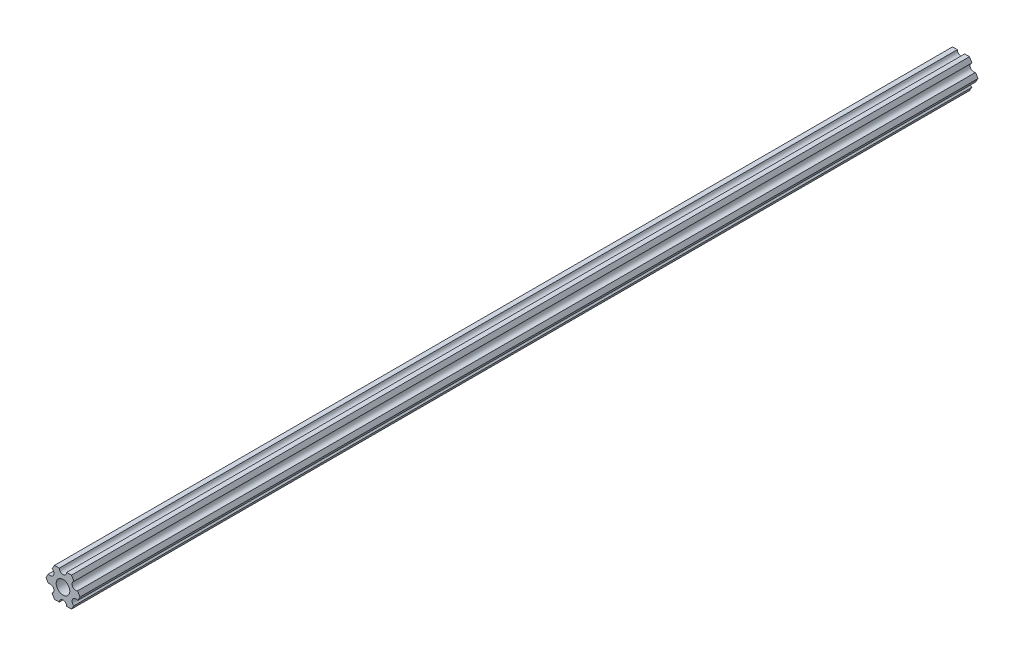
ISO-10303-21;
HEADER;
FILE_DESCRIPTION(('STEP AP214'),'2;1');
FILE_NAME('part.step','',(''),(''),'','','');
FILE_SCHEMA(('AUTOMOTIVE_DESIGN { 1 0 10303 214 1 1 1 1 }'));
ENDSEC;
DATA;
#1=APPLICATION_CONTEXT('core data for automotive mechanical design processes');
#2=APPLICATION_PROTOCOL_DEFINITION('international standard','automotive_design',2000,#1);
#3=PRODUCT_CONTEXT('',#1,'mechanical');
#4=PRODUCT('Part','Part','',(#3));
#5=PRODUCT_RELATED_PRODUCT_CATEGORY('part','',(#4));
#6=PRODUCT_DEFINITION_FORMATION('','',#4);
#7=PRODUCT_DEFINITION_CONTEXT('part definition',#1,'design');
#8=PRODUCT_DEFINITION('design','',#6,#7);
#9=PRODUCT_DEFINITION_SHAPE('','',#8);
#10=(LENGTH_UNIT() NAMED_UNIT(*) SI_UNIT(.MILLI.,.METRE.));
#11=(NAMED_UNIT(*) PLANE_ANGLE_UNIT() SI_UNIT($,.RADIAN.));
#12=(NAMED_UNIT(*) SI_UNIT($,.STERADIAN.) SOLID_ANGLE_UNIT());
#13=UNCERTAINTY_MEASURE_WITH_UNIT(LENGTH_MEASURE(1.E-05),#10,'distance_accuracy_value','');
#14=(GEOMETRIC_REPRESENTATION_CONTEXT(3) GLOBAL_UNCERTAINTY_ASSIGNED_CONTEXT((#13)) GLOBAL_UNIT_ASSIGNED_CONTEXT((#10,
#11,#12)) REPRESENTATION_CONTEXT('',''));
#15=CARTESIAN_POINT('',(0.,0.,0.));
#16=DIRECTION('',(0.,0.,1.));
#17=DIRECTION('',(1.,0.,0.));
#18=AXIS2_PLACEMENT_3D('',#15,#16,#17);
#19=CARTESIAN_POINT('',(6.29301142309098,-1.80018429024546,387.35));
#20=DIRECTION('',(-0.866025434075723,0.499999947533953,0.));
#21=DIRECTION('',(-0.499999947533953,-0.866025434075723,0.));
#22=AXIS2_PLACEMENT_3D('',#19,#20,#21);
#23=PLANE('',#22);
#24=DIRECTION('',(0.,0.,1.));
#25=VECTOR('',#24,1.);
#26=CARTESIAN_POINT('',(7.33234841870826,4.44212519169686E-07,387.35));
#27=LINE('',#26,#25);
#28=CARTESIAN_POINT('',(7.33234841870826,4.44212518961143E-07,0.));
#29=VERTEX_POINT('',#28);
#30=CARTESIAN_POINT('',(7.33234841870826,4.44212519315656E-07,387.35));
#31=VERTEX_POINT('',#30);
#32=EDGE_CURVE('E299',#29,#31,#27,.T.);
#33=ORIENTED_EDGE('',*,*,#32,.T.);
#34=DIRECTION('',(0.499999947533953,0.866025434075723,0.));
#35=VECTOR('',#34,1.);
#36=CARTESIAN_POINT('',(6.29301142309098,-1.80018429024546,387.35));
#37=LINE('',#36,#35);
#38=CARTESIAN_POINT('',(6.29301142309098,-1.80018429024546,387.35));
#39=VERTEX_POINT('',#38);
#40=EDGE_CURVE('E182',#39,#31,#37,.T.);
#41=ORIENTED_EDGE('',*,*,#40,.F.);
#42=DIRECTION('',(0.,0.,-1.));
#43=VECTOR('',#42,1.);
#44=CARTESIAN_POINT('',(6.29301142309098,-1.80018429024546,387.35));
#45=LINE('',#44,#43);
#46=CARTESIAN_POINT('',(6.29301142309098,-1.80018429024546,0.));
#47=VERTEX_POINT('',#46);
#48=EDGE_CURVE('E248',#39,#47,#45,.T.);
#49=ORIENTED_EDGE('',*,*,#48,.T.);
#50=DIRECTION('',(0.499999947533953,0.866025434075723,0.));
#51=VECTOR('',#50,1.);
#52=CARTESIAN_POINT('',(6.29301142309098,-1.80018429024546,0.));
#53=LINE('',#52,#51);
#54=EDGE_CURVE('E186',#47,#29,#53,.T.);
#55=ORIENTED_EDGE('',*,*,#54,.T.);
#56=EDGE_LOOP('',(#33,#41,#49,#55));
#57=FACE_BOUND('',#56,.T.);
#58=ADVANCED_FACE('F17',(#57),#23,.F.);
#59=CARTESIAN_POINT('',(7.33234841870826,4.44212519169686E-07,387.35));
#60=DIRECTION('',(-0.866025373493145,-0.500000052466056,0.));
#61=DIRECTION('',(0.500000052466056,-0.866025373493145,0.));
#62=AXIS2_PLACEMENT_3D('',#59,#60,#61);
#63=PLANE('',#62);
#64=DIRECTION('',(0.,0.,-1.));
#65=VECTOR('',#64,1.);
#66=CARTESIAN_POINT('',(6.29301120497139,1.80018505273895,387.35));
#67=LINE('',#66,#65);
#68=CARTESIAN_POINT('',(6.29301120497139,1.80018505273895,0.));
#69=VERTEX_POINT('',#68);
#70=CARTESIAN_POINT('',(6.29301120497139,1.80018505273895,387.35));
#71=VERTEX_POINT('',#70);
#72=EDGE_CURVE('E297',#69,#71,#67,.F.);
#73=ORIENTED_EDGE('',*,*,#72,.T.);
#74=DIRECTION('',(-0.500000052466056,0.866025373493145,0.));
#75=VECTOR('',#74,1.);
#76=CARTESIAN_POINT('',(7.33234841870826,4.44212519198905E-07,387.35));
#77=LINE('',#76,#75);
#78=EDGE_CURVE('E64',#31,#71,#77,.T.);
#79=ORIENTED_EDGE('',*,*,#78,.F.);
#80=ORIENTED_EDGE('',*,*,#32,.F.);
#81=DIRECTION('',(-0.500000052466056,0.866025373493145,0.));
#82=VECTOR('',#81,1.);
#83=CARTESIAN_POINT('',(7.33234841870826,4.44212519198905E-07,0.));
#84=LINE('',#83,#82);
#85=EDGE_CURVE('E245',#29,#69,#84,.T.);
#86=ORIENTED_EDGE('',*,*,#85,.T.);
#87=EDGE_LOOP('',(#73,#79,#80,#86));
#88=FACE_BOUND('',#87,.T.);
#89=ADVANCED_FACE('F346',(#88),#63,.F.);
#90=CARTESIAN_POINT('',(5.49926112168156,3.17500033315933,387.35));
#91=DIRECTION('',(0.,0.,-1.));
#92=DIRECTION('',(-1.,0.,0.));
#93=AXIS2_PLACEMENT_3D('',#90,#91,#92);
#94=CYLINDRICAL_SURFACE('',#93,1.5875);
#95=CARTESIAN_POINT('',(5.49926112168156,3.17500033315933,387.35));
#96=DIRECTION('',(0.,0.,-1.));
#97=DIRECTION('',(-1.,0.,0.));
#98=AXIS2_PLACEMENT_3D('',#95,#96,#97);
#99=CIRCLE('',#98,1.5875);
#100=CARTESIAN_POINT('',(4.70551103839172,4.54981561357972,387.35));
#101=VERTEX_POINT('',#100);
#102=EDGE_CURVE('E56',#71,#101,#99,.T.);
#103=ORIENTED_EDGE('',*,*,#102,.F.);
#104=ORIENTED_EDGE('',*,*,#72,.F.);
#105=CARTESIAN_POINT('',(5.49926112168156,3.17500033315933,0.));
#106=DIRECTION('',(0.,0.,-1.));
#107=DIRECTION('',(-1.,0.,0.));
#108=AXIS2_PLACEMENT_3D('',#105,#106,#107);
#109=CIRCLE('',#108,1.5875);
#110=CARTESIAN_POINT('',(4.70551103839172,4.54981561357972,0.));
#111=VERTEX_POINT('',#110);
#112=EDGE_CURVE('E20',#69,#111,#109,.T.);
#113=ORIENTED_EDGE('',*,*,#112,.T.);
#114=DIRECTION('',(0.,0.,1.));
#115=VECTOR('',#114,1.);
#116=CARTESIAN_POINT('',(4.70551103839172,4.54981561357972,387.35));
#117=LINE('',#116,#115);
#118=EDGE_CURVE('E293',#111,#101,#117,.T.);
#119=ORIENTED_EDGE('',*,*,#118,.T.);
#120=EDGE_LOOP('',(#103,#104,#113,#119));
#121=FACE_BOUND('',#120,.T.);
#122=ADVANCED_FACE('F344',(#121),#94,.F.);
#123=CARTESIAN_POINT('',(4.70551103839172,4.54981561357972,387.35));
#124=DIRECTION('',(-0.866025373493151,-0.500000052466046,0.));
#125=DIRECTION('',(0.500000052466046,-0.866025373493151,0.));
#126=AXIS2_PLACEMENT_3D('',#123,#124,#125);
#127=PLANE('',#126);
#128=DIRECTION('',(0.,0.,1.));
#129=VECTOR('',#128,1.);
#130=CARTESIAN_POINT('',(3.66617382465481,6.35000022210627,387.35));
#131=LINE('',#130,#129);
#132=CARTESIAN_POINT('',(3.66617382465481,6.35000022210627,-1.48029736616688E-13));
#133=VERTEX_POINT('',#132);
#134=CARTESIAN_POINT('',(3.66617382465481,6.35000022210627,387.35));
#135=VERTEX_POINT('',#134);
#136=EDGE_CURVE('E290',#133,#135,#131,.T.);
#137=ORIENTED_EDGE('',*,*,#136,.T.);
#138=DIRECTION('',(-0.500000052466046,0.866025373493151,0.));
#139=VECTOR('',#138,1.);
#140=CARTESIAN_POINT('',(4.70551103839172,4.54981561357972,387.35));
#141=LINE('',#140,#139);
#142=EDGE_CURVE('E175',#101,#135,#141,.T.);
#143=ORIENTED_EDGE('',*,*,#142,.F.);
#144=ORIENTED_EDGE('',*,*,#118,.F.);
#145=DIRECTION('',(-0.500000052466046,0.866025373493151,0.));
#146=VECTOR('',#145,1.);
#147=CARTESIAN_POINT('',(4.70551103839172,4.54981561357972,0.));
#148=LINE('',#147,#146);
#149=EDGE_CURVE('E238',#111,#133,#148,.T.);
#150=ORIENTED_EDGE('',*,*,#149,.T.);
#151=EDGE_LOOP('',(#137,#143,#144,#150));
#152=FACE_BOUND('',#151,.T.);
#153=ADVANCED_FACE('F337',(#152),#127,.F.);
#154=CARTESIAN_POINT('',(3.66617382465481,6.35000022210627,387.35));
#155=DIRECTION('',(6.05825850611185E-08,-0.999999999999998,0.));
#156=DIRECTION('',(0.999999999999998,6.05825850611185E-08,0.));
#157=AXIS2_PLACEMENT_3D('',#154,#155,#156);
#158=PLANE('',#157);
#159=DIRECTION('',(0.,0.,-1.));
#160=VECTOR('',#159,1.);
#161=CARTESIAN_POINT('',(1.58749961530074,6.35000009617482,387.35));
#162=LINE('',#161,#160);
#163=CARTESIAN_POINT('',(1.58749961530073,6.35000015914054,0.));
#164=VERTEX_POINT('',#163);
#165=CARTESIAN_POINT('',(1.58749961530073,6.35000015914054,387.35));
#166=VERTEX_POINT('',#165);
#167=EDGE_CURVE('E288',#164,#166,#162,.F.);
#168=ORIENTED_EDGE('',*,*,#167,.T.);
#169=DIRECTION('',(1.,0.,0.));
#170=VECTOR('',#169,1.);
#171=CARTESIAN_POINT('',(5.49926112168156,6.35000022210627,387.35));
#172=LINE('',#171,#170);
#173=EDGE_CURVE('E145',#135,#166,#172,.F.);
#174=ORIENTED_EDGE('',*,*,#173,.F.);
#175=ORIENTED_EDGE('',*,*,#136,.F.);
#176=DIRECTION('',(1.,0.,0.));
#177=VECTOR('',#176,1.);
#178=CARTESIAN_POINT('',(5.49926112168156,6.35000022210627,0.));
#179=LINE('',#178,#177);
#180=EDGE_CURVE('E235',#133,#164,#179,.F.);
#181=ORIENTED_EDGE('',*,*,#180,.T.);
#182=EDGE_LOOP('',(#168,#174,#175,#181));
#183=FACE_BOUND('',#182,.T.);
#184=ADVANCED_FACE('F334',(#183),#158,.F.);
#185=CARTESIAN_POINT('',(-3.84699260060323E-07,6.35,387.35));
#186=DIRECTION('',(0.,0.,-1.));
#187=DIRECTION('',(-1.,0.,0.));
#188=AXIS2_PLACEMENT_3D('',#185,#186,#187);
#189=CYLINDRICAL_SURFACE('',#188,1.5875);
#190=DIRECTION('',(0.,0.,1.));
#191=VECTOR('',#190,1.);
#192=CARTESIAN_POINT('',(-1.58750038469926,6.34999990382518,387.35));
#193=LINE('',#192,#191);
#194=CARTESIAN_POINT('',(-1.58750038469926,6.34999990382518,0.));
#195=VERTEX_POINT('',#194);
#196=CARTESIAN_POINT('',(-1.58750038469926,6.34999990382518,387.35));
#197=VERTEX_POINT('',#196);
#198=EDGE_CURVE('E104',#195,#197,#193,.T.);
#199=ORIENTED_EDGE('',*,*,#198,.T.);
#200=CARTESIAN_POINT('',(-3.84699260060323E-07,6.35,387.35));
#201=DIRECTION('',(0.,0.,-1.));
#202=DIRECTION('',(-1.,0.,0.));
#203=AXIS2_PLACEMENT_3D('',#200,#201,#202);
#204=CIRCLE('',#203,1.5875);
#205=EDGE_CURVE('E149',#166,#197,#204,.T.);
#206=ORIENTED_EDGE('',*,*,#205,.F.);
#207=ORIENTED_EDGE('',*,*,#167,.F.);
#208=CARTESIAN_POINT('',(-3.84699260060323E-07,6.35,0.));
#209=DIRECTION('',(0.,0.,-1.));
#210=DIRECTION('',(-1.,0.,0.));
#211=AXIS2_PLACEMENT_3D('',#208,#209,#210);
#212=CIRCLE('',#211,1.5875);
#213=EDGE_CURVE('E232',#164,#195,#212,.T.);
#214=ORIENTED_EDGE('',*,*,#213,.T.);
#215=EDGE_LOOP('',(#199,#206,#207,#214));
#216=FACE_BOUND('',#215,.T.);
#217=ADVANCED_FACE('F328',(#216),#189,.F.);
#218=CARTESIAN_POINT('',(-1.58750038469926,6.34999990382518,387.35));
#219=DIRECTION('',(6.05825963273174E-08,-0.999999999999998,0.));
#220=DIRECTION('',(0.999999999999998,6.05825963273174E-08,0.));
#221=AXIS2_PLACEMENT_3D('',#218,#219,#220);
#222=PLANE('',#221);
#223=DIRECTION('',(0.,0.,1.));
#224=VECTOR('',#223,1.);
#225=CARTESIAN_POINT('',(-3.66617459405349,6.3499997778937,387.35));
#226=LINE('',#225,#224);
#227=CARTESIAN_POINT('',(-3.66617454558244,6.34999986184803,-1.48029736616688E-13));
#228=VERTEX_POINT('',#227);
#229=CARTESIAN_POINT('',(-3.66617454558244,6.34999986184803,387.35));
#230=VERTEX_POINT('',#229);
#231=EDGE_CURVE('E112',#228,#230,#226,.T.);
#232=ORIENTED_EDGE('',*,*,#231,.T.);
#233=DIRECTION('',(1.,0.,0.));
#234=VECTOR('',#233,1.);
#235=CARTESIAN_POINT('',(5.49926112168156,6.34999990382518,387.35));
#236=LINE('',#235,#234);
#237=EDGE_CURVE('E150',#197,#230,#236,.F.);
#238=ORIENTED_EDGE('',*,*,#237,.F.);
#239=ORIENTED_EDGE('',*,*,#198,.F.);
#240=DIRECTION('',(1.,0.,0.));
#241=VECTOR('',#240,1.);
#242=CARTESIAN_POINT('',(5.49926112168156,6.34999990382518,0.));
#243=LINE('',#242,#241);
#244=EDGE_CURVE('E157',#195,#228,#243,.F.);
#245=ORIENTED_EDGE('',*,*,#244,.T.);
#246=EDGE_LOOP('',(#232,#238,#239,#245));
#247=FACE_BOUND('',#246,.T.);
#248=ADVANCED_FACE('F156',(#247),#222,.F.);
#249=CARTESIAN_POINT('',(-3.66617459405349,6.3499997778937,387.35));
#250=DIRECTION('',(0.866025434075729,-0.499999947533942,0.));
#251=DIRECTION('',(0.499999947533942,0.866025434075729,0.));
#252=AXIS2_PLACEMENT_3D('',#249,#250,#251);
#253=PLANE('',#252);
#254=DIRECTION('',(0.,0.,-1.));
#255=VECTOR('',#254,1.);
#256=CARTESIAN_POINT('',(-4.70551158967065,4.54981504343587,387.35));
#257=LINE('',#256,#255);
#258=CARTESIAN_POINT('',(-4.70551158967065,4.54981504343587,0.));
#259=VERTEX_POINT('',#258);
#260=CARTESIAN_POINT('',(-4.70551158967065,4.54981504343587,387.35));
#261=VERTEX_POINT('',#260);
#262=EDGE_CURVE('E158',#259,#261,#257,.F.);
#263=ORIENTED_EDGE('',*,*,#262,.T.);
#264=DIRECTION('',(-0.499999947533943,-0.866025434075729,0.));
#265=VECTOR('',#264,1.);
#266=CARTESIAN_POINT('',(-3.66617459405349,6.3499997778937,387.35));
#267=LINE('',#266,#265);
#268=EDGE_CURVE('E153',#230,#261,#267,.T.);
#269=ORIENTED_EDGE('',*,*,#268,.F.);
#270=ORIENTED_EDGE('',*,*,#231,.F.);
#271=DIRECTION('',(-0.499999947533943,-0.866025434075729,0.));
#272=VECTOR('',#271,1.);
#273=CARTESIAN_POINT('',(-3.66617459405349,6.3499997778937,0.));
#274=LINE('',#273,#272);
#275=EDGE_CURVE('E227',#228,#259,#274,.T.);
#276=ORIENTED_EDGE('',*,*,#275,.T.);
#277=EDGE_LOOP('',(#263,#269,#270,#276));
#278=FACE_BOUND('',#277,.T.);
#279=ADVANCED_FACE('F160',(#278),#253,.F.);
#280=CARTESIAN_POINT('',(-5.49926150638082,3.17499966684067,387.35));
#281=DIRECTION('',(0.,0.,-1.));
#282=DIRECTION('',(-1.,0.,0.));
#283=AXIS2_PLACEMENT_3D('',#280,#281,#282);
#284=CYLINDRICAL_SURFACE('',#283,1.5875);
#285=DIRECTION('',(0.,0.,1.));
#286=VECTOR('',#285,1.);
#287=CARTESIAN_POINT('',(-6.29301142309098,1.80018429024547,387.35));
#288=LINE('',#287,#286);
#289=CARTESIAN_POINT('',(-6.29301142309098,1.80018429024547,0.));
#290=VERTEX_POINT('',#289);
#291=CARTESIAN_POINT('',(-6.29301142309098,1.80018429024547,387.35));
#292=VERTEX_POINT('',#291);
#293=EDGE_CURVE('E279',#290,#292,#288,.T.);
#294=ORIENTED_EDGE('',*,*,#293,.T.);
#295=CARTESIAN_POINT('',(-5.49926150638082,3.17499966684067,387.35));
#296=DIRECTION('',(0.,0.,-1.));
#297=DIRECTION('',(-1.,0.,0.));
#298=AXIS2_PLACEMENT_3D('',#295,#296,#297);
#299=CIRCLE('',#298,1.5875);
#300=EDGE_CURVE('E162',#261,#292,#299,.T.);
#301=ORIENTED_EDGE('',*,*,#300,.F.);
#302=ORIENTED_EDGE('',*,*,#262,.F.);
#303=CARTESIAN_POINT('',(-5.49926150638082,3.17499966684067,0.));
#304=DIRECTION('',(0.,0.,-1.));
#305=DIRECTION('',(-1.,0.,0.));
#306=AXIS2_PLACEMENT_3D('',#303,#304,#305);
#307=CIRCLE('',#306,1.5875);
#308=EDGE_CURVE('E224',#259,#290,#307,.T.);
#309=ORIENTED_EDGE('',*,*,#308,.T.);
#310=EDGE_LOOP('',(#294,#301,#302,#309));
#311=FACE_BOUND('',#310,.T.);
#312=ADVANCED_FACE('F409',(#311),#284,.F.);
#313=CARTESIAN_POINT('',(-6.29301142309098,1.80018429024547,387.35));
#314=DIRECTION('',(0.866025434075724,-0.499999947533951,0.));
#315=DIRECTION('',(0.499999947533951,0.866025434075724,0.));
#316=AXIS2_PLACEMENT_3D('',#313,#314,#315);
#317=PLANE('',#316);
#318=DIRECTION('',(0.,0.,1.));
#319=VECTOR('',#318,1.);
#320=CARTESIAN_POINT('',(-7.33234841870826,-4.44212523790841E-07,387.35));
#321=LINE('',#320,#319);
#322=CARTESIAN_POINT('',(-7.33234841870826,-4.44212524036367E-07,0.));
#323=VERTEX_POINT('',#322);
#324=CARTESIAN_POINT('',(-7.33234841870826,-4.44212524036367E-07,387.35));
#325=VERTEX_POINT('',#324);
#326=EDGE_CURVE('E276',#323,#325,#321,.T.);
#327=ORIENTED_EDGE('',*,*,#326,.T.);
#328=DIRECTION('',(-0.499999947533952,-0.866025434075724,0.));
#329=VECTOR('',#328,1.);
#330=CARTESIAN_POINT('',(-6.29301142309098,1.80018429024547,387.35));
#331=LINE('',#330,#329);
#332=EDGE_CURVE('E164',#292,#325,#331,.T.);
#333=ORIENTED_EDGE('',*,*,#332,.F.);
#334=ORIENTED_EDGE('',*,*,#293,.F.);
#335=DIRECTION('',(-0.499999947533952,-0.866025434075724,0.));
#336=VECTOR('',#335,1.);
#337=CARTESIAN_POINT('',(-6.29301142309098,1.80018429024547,0.));
#338=LINE('',#337,#336);
#339=EDGE_CURVE('E219',#290,#323,#338,.T.);
#340=ORIENTED_EDGE('',*,*,#339,.T.);
#341=EDGE_LOOP('',(#327,#333,#334,#340));
#342=FACE_BOUND('',#341,.T.);
#343=ADVANCED_FACE('F377',(#342),#317,.F.);
#344=CARTESIAN_POINT('',(-7.33234841870826,-4.44212523790841E-07,387.35));
#345=DIRECTION('',(0.866025373493151,0.500000052466045,0.));
#346=DIRECTION('',(-0.500000052466045,0.866025373493151,0.));
#347=AXIS2_PLACEMENT_3D('',#344,#345,#346);
#348=PLANE('',#347);
#349=DIRECTION('',(0.,0.,-1.));
#350=VECTOR('',#349,1.);
#351=CARTESIAN_POINT('',(-6.29301120497141,-1.80018505273896,387.35));
#352=LINE('',#351,#350);
#353=CARTESIAN_POINT('',(-6.29301120497141,-1.80018505273896,0.));
#354=VERTEX_POINT('',#353);
#355=CARTESIAN_POINT('',(-6.29301120497141,-1.80018505273896,387.35));
#356=VERTEX_POINT('',#355);
#357=EDGE_CURVE('E273',#354,#356,#352,.F.);
#358=ORIENTED_EDGE('',*,*,#357,.T.);
#359=DIRECTION('',(0.500000052466045,-0.866025373493151,0.));
#360=VECTOR('',#359,1.);
#361=CARTESIAN_POINT('',(-7.33234841870826,-4.44212523969395E-07,387.35));
#362=LINE('',#361,#360);
#363=EDGE_CURVE('E314',#325,#356,#362,.T.);
#364=ORIENTED_EDGE('',*,*,#363,.F.);
#365=ORIENTED_EDGE('',*,*,#326,.F.);
#366=DIRECTION('',(0.500000052466045,-0.866025373493151,0.));
#367=VECTOR('',#366,1.);
#368=CARTESIAN_POINT('',(-7.33234841870826,-4.44212523969395E-07,0.));
#369=LINE('',#368,#367);
#370=EDGE_CURVE('E216',#323,#354,#369,.T.);
#371=ORIENTED_EDGE('',*,*,#370,.T.);
#372=EDGE_LOOP('',(#358,#364,#365,#371));
#373=FACE_BOUND('',#372,.T.);
#374=ADVANCED_FACE('F381',(#373),#348,.F.);
#375=CARTESIAN_POINT('',(-5.49926112168156,-3.17500033315934,387.35));
#376=DIRECTION('',(0.,0.,-1.));
#377=DIRECTION('',(-1.,0.,0.));
#378=AXIS2_PLACEMENT_3D('',#375,#376,#377);
#379=CYLINDRICAL_SURFACE('',#378,1.5875);
#380=DIRECTION('',(0.,0.,1.));
#381=VECTOR('',#380,1.);
#382=CARTESIAN_POINT('',(-4.70551103839172,-4.54981561357972,387.35));
#383=LINE('',#382,#381);
#384=CARTESIAN_POINT('',(-4.70551103839172,-4.54981561357972,0.));
#385=VERTEX_POINT('',#384);
#386=CARTESIAN_POINT('',(-4.70551103839172,-4.54981561357972,387.35));
#387=VERTEX_POINT('',#386);
#388=EDGE_CURVE('E268',#385,#387,#383,.T.);
#389=ORIENTED_EDGE('',*,*,#388,.T.);
#390=CARTESIAN_POINT('',(-5.49926112168156,-3.17500033315934,387.35));
#391=DIRECTION('',(0.,0.,-1.));
#392=DIRECTION('',(-1.,0.,0.));
#393=AXIS2_PLACEMENT_3D('',#390,#391,#392);
#394=CIRCLE('',#393,1.5875);
#395=EDGE_CURVE('E312',#356,#387,#394,.T.);
#396=ORIENTED_EDGE('',*,*,#395,.F.);
#397=ORIENTED_EDGE('',*,*,#357,.F.);
#398=CARTESIAN_POINT('',(-5.49926112168156,-3.17500033315934,0.));
#399=DIRECTION('',(0.,0.,-1.));
#400=DIRECTION('',(-1.,0.,0.));
#401=AXIS2_PLACEMENT_3D('',#398,#399,#400);
#402=CIRCLE('',#401,1.5875);
#403=EDGE_CURVE('E213',#354,#385,#402,.T.);
#404=ORIENTED_EDGE('',*,*,#403,.T.);
#405=EDGE_LOOP('',(#389,#396,#397,#404));
#406=FACE_BOUND('',#405,.T.);
#407=ADVANCED_FACE('F385',(#406),#379,.F.);
#408=CARTESIAN_POINT('',(-4.70551103839172,-4.54981561357972,387.35));
#409=DIRECTION('',(0.866025373493151,0.500000052466045,0.));
#410=DIRECTION('',(-0.500000052466045,0.866025373493151,0.));
#411=AXIS2_PLACEMENT_3D('',#408,#409,#410);
#412=PLANE('',#411);
#413=DIRECTION('',(0.,0.,1.));
#414=VECTOR('',#413,1.);
#415=CARTESIAN_POINT('',(-3.66617382465481,-6.35000022210628,387.35));
#416=LINE('',#415,#414);
#417=CARTESIAN_POINT('',(-3.6661738246548,-6.35000022210628,-1.48029736616688E-13));
#418=VERTEX_POINT('',#417);
#419=CARTESIAN_POINT('',(-3.6661738246548,-6.35000022210628,387.35));
#420=VERTEX_POINT('',#419);
#421=EDGE_CURVE('E265',#418,#420,#416,.T.);
#422=ORIENTED_EDGE('',*,*,#421,.T.);
#423=DIRECTION('',(0.500000052466045,-0.866025373493151,0.));
#424=VECTOR('',#423,1.);
#425=CARTESIAN_POINT('',(-4.70551103839172,-4.54981561357972,387.35));
#426=LINE('',#425,#424);
#427=EDGE_CURVE('E313',#387,#420,#426,.T.);
#428=ORIENTED_EDGE('',*,*,#427,.F.);
#429=ORIENTED_EDGE('',*,*,#388,.F.);
#430=DIRECTION('',(0.500000052466045,-0.866025373493151,0.));
#431=VECTOR('',#430,1.);
#432=CARTESIAN_POINT('',(-4.70551103839172,-4.54981561357972,0.));
#433=LINE('',#432,#431);
#434=EDGE_CURVE('E208',#385,#418,#433,.T.);
#435=ORIENTED_EDGE('',*,*,#434,.T.);
#436=EDGE_LOOP('',(#422,#428,#429,#435));
#437=FACE_BOUND('',#436,.T.);
#438=ADVANCED_FACE('F391',(#437),#412,.F.);
#439=CARTESIAN_POINT('',(-3.66617382465481,-6.35000022210628,387.35));
#440=DIRECTION('',(-6.05825854783851E-08,0.999999999999998,0.));
#441=DIRECTION('',(-0.999999999999998,-6.05825854783851E-08,0.));
#442=AXIS2_PLACEMENT_3D('',#439,#440,#441);
#443=PLANE('',#442);
#444=DIRECTION('',(0.,0.,-1.));
#445=VECTOR('',#444,1.);
#446=CARTESIAN_POINT('',(-1.58749961530074,-6.35,387.35));
#447=LINE('',#446,#445);
#448=CARTESIAN_POINT('',(-1.58749961530073,-6.35000011105314,0.));
#449=VERTEX_POINT('',#448);
#450=CARTESIAN_POINT('',(-1.58749961530073,-6.35000011105314,387.35));
#451=VERTEX_POINT('',#450);
#452=EDGE_CURVE('E262',#449,#451,#447,.F.);
#453=ORIENTED_EDGE('',*,*,#452,.T.);
#454=DIRECTION('',(1.,0.,0.));
#455=VECTOR('',#454,1.);
#456=CARTESIAN_POINT('',(5.49926112168156,-6.35000022210628,387.35));
#457=LINE('',#456,#455);
#458=EDGE_CURVE('E311',#420,#451,#457,.T.);
#459=ORIENTED_EDGE('',*,*,#458,.F.);
#460=ORIENTED_EDGE('',*,*,#421,.F.);
#461=DIRECTION('',(1.,0.,0.));
#462=VECTOR('',#461,1.);
#463=CARTESIAN_POINT('',(5.49926112168156,-6.35000022210628,0.));
#464=LINE('',#463,#462);
#465=EDGE_CURVE('E205',#418,#449,#464,.T.);
#466=ORIENTED_EDGE('',*,*,#465,.T.);
#467=EDGE_LOOP('',(#453,#459,#460,#466));
#468=FACE_BOUND('',#467,.T.);
#469=ADVANCED_FACE('F395',(#468),#443,.F.);
#470=CARTESIAN_POINT('',(3.8469926204343E-07,-6.35,387.35));
#471=DIRECTION('',(0.,0.,-1.));
#472=DIRECTION('',(-1.,0.,0.));
#473=AXIS2_PLACEMENT_3D('',#470,#471,#472);
#474=CYLINDRICAL_SURFACE('',#473,1.5875);
#475=DIRECTION('',(0.,0.,1.));
#476=VECTOR('',#475,1.);
#477=CARTESIAN_POINT('',(1.58750038469926,-6.34999990382518,387.35));
#478=LINE('',#477,#476);
#479=CARTESIAN_POINT('',(1.58750038469926,-6.34999990382518,0.));
#480=VERTEX_POINT('',#479);
#481=CARTESIAN_POINT('',(1.58750038469926,-6.34999990382518,387.35));
#482=VERTEX_POINT('',#481);
#483=EDGE_CURVE('E257',#480,#482,#478,.T.);
#484=ORIENTED_EDGE('',*,*,#483,.T.);
#485=CARTESIAN_POINT('',(3.8469926204343E-07,-6.35,387.35));
#486=DIRECTION('',(0.,0.,-1.));
#487=DIRECTION('',(-1.,0.,0.));
#488=AXIS2_PLACEMENT_3D('',#485,#486,#487);
#489=CIRCLE('',#488,1.5875);
#490=EDGE_CURVE('E308',#451,#482,#489,.T.);
#491=ORIENTED_EDGE('',*,*,#490,.F.);
#492=ORIENTED_EDGE('',*,*,#452,.F.);
#493=CARTESIAN_POINT('',(3.8469926204343E-07,-6.35,0.));
#494=DIRECTION('',(0.,0.,-1.));
#495=DIRECTION('',(-1.,0.,0.));
#496=AXIS2_PLACEMENT_3D('',#493,#494,#495);
#497=CIRCLE('',#496,1.5875);
#498=EDGE_CURVE('E202',#449,#480,#497,.T.);
#499=ORIENTED_EDGE('',*,*,#498,.T.);
#500=EDGE_LOOP('',(#484,#491,#492,#499));
#501=FACE_BOUND('',#500,.T.);
#502=ADVANCED_FACE('F399',(#501),#474,.F.);
#503=CARTESIAN_POINT('',(1.58750038469926,-6.34999990382518,387.35));
#504=DIRECTION('',(-6.05825721258438E-08,0.999999999999998,0.));
#505=DIRECTION('',(-0.999999999999998,-6.05825721258438E-08,0.));
#506=AXIS2_PLACEMENT_3D('',#503,#504,#505);
#507=PLANE('',#506);
#508=DIRECTION('',(0.,0.,1.));
#509=VECTOR('',#508,1.);
#510=CARTESIAN_POINT('',(3.66617459405346,-6.34999977789375,387.35));
#511=LINE('',#510,#509);
#512=CARTESIAN_POINT('',(3.66617454558244,-6.34999986184804,-1.48029736616688E-13));
#513=VERTEX_POINT('',#512);
#514=CARTESIAN_POINT('',(3.66617454558244,-6.34999986184804,387.35));
#515=VERTEX_POINT('',#514);
#516=EDGE_CURVE('E254',#513,#515,#511,.T.);
#517=ORIENTED_EDGE('',*,*,#516,.T.);
#518=DIRECTION('',(1.,0.,0.));
#519=VECTOR('',#518,1.);
#520=CARTESIAN_POINT('',(5.49926112168156,-6.34999990382518,387.35));
#521=LINE('',#520,#519);
#522=EDGE_CURVE('E310',#482,#515,#521,.T.);
#523=ORIENTED_EDGE('',*,*,#522,.F.);
#524=ORIENTED_EDGE('',*,*,#483,.F.);
#525=DIRECTION('',(1.,0.,0.));
#526=VECTOR('',#525,1.);
#527=CARTESIAN_POINT('',(5.49926112168156,-6.34999990382518,0.));
#528=LINE('',#527,#526);
#529=EDGE_CURVE('E197',#480,#513,#528,.T.);
#530=ORIENTED_EDGE('',*,*,#529,.T.);
#531=EDGE_LOOP('',(#517,#523,#524,#530));
#532=FACE_BOUND('',#531,.T.);
#533=ADVANCED_FACE('F402',(#532),#507,.F.);
#534=CARTESIAN_POINT('',(3.66617459405346,-6.34999977789375,387.35));
#535=DIRECTION('',(-0.86602543407573,0.499999947533941,0.));
#536=DIRECTION('',(-0.499999947533941,-0.86602543407573,0.));
#537=AXIS2_PLACEMENT_3D('',#534,#535,#536);
#538=PLANE('',#537);
#539=DIRECTION('',(0.,0.,1.));
#540=VECTOR('',#539,1.);
#541=CARTESIAN_POINT('',(4.70551158967065,-4.54981504343587,387.35));
#542=LINE('',#541,#540);
#543=CARTESIAN_POINT('',(4.70551158967065,-4.54981504343587,387.35));
#544=VERTEX_POINT('',#543);
#545=CARTESIAN_POINT('',(4.70551158967065,-4.54981504343587,0.));
#546=VERTEX_POINT('',#545);
#547=EDGE_CURVE('E252',#544,#546,#542,.F.);
#548=ORIENTED_EDGE('',*,*,#547,.F.);
#549=DIRECTION('',(0.49999994753394,0.86602543407573,0.));
#550=VECTOR('',#549,1.);
#551=CARTESIAN_POINT('',(3.66617459405346,-6.34999977789376,387.35));
#552=LINE('',#551,#550);
#553=EDGE_CURVE('E307',#515,#544,#552,.T.);
#554=ORIENTED_EDGE('',*,*,#553,.F.);
#555=ORIENTED_EDGE('',*,*,#516,.F.);
#556=DIRECTION('',(0.49999994753394,0.86602543407573,0.));
#557=VECTOR('',#556,1.);
#558=CARTESIAN_POINT('',(3.66617459405346,-6.34999977789376,0.));
#559=LINE('',#558,#557);
#560=EDGE_CURVE('E194',#513,#546,#559,.T.);
#561=ORIENTED_EDGE('',*,*,#560,.T.);
#562=EDGE_LOOP('',(#548,#554,#555,#561));
#563=FACE_BOUND('',#562,.T.);
#564=ADVANCED_FACE('F404',(#563),#538,.F.);
#565=CARTESIAN_POINT('',(5.49926150638082,-3.17499966684067,387.35));
#566=DIRECTION('',(0.,0.,-1.));
#567=DIRECTION('',(-1.,0.,0.));
#568=AXIS2_PLACEMENT_3D('',#565,#566,#567);
#569=CYLINDRICAL_SURFACE('',#568,1.58750000000001);
#570=CARTESIAN_POINT('',(5.49926150638082,-3.17499966684067,387.35));
#571=DIRECTION('',(0.,0.,-1.));
#572=DIRECTION('',(-1.,0.,0.));
#573=AXIS2_PLACEMENT_3D('',#570,#571,#572);
#574=CIRCLE('',#573,1.58750000000001);
#575=EDGE_CURVE('E35',#544,#39,#574,.T.);
#576=ORIENTED_EDGE('',*,*,#575,.F.);
#577=ORIENTED_EDGE('',*,*,#547,.T.);
#578=CARTESIAN_POINT('',(5.49926150638082,-3.17499966684067,0.));
#579=DIRECTION('',(0.,0.,-1.));
#580=DIRECTION('',(-1.,0.,0.));
#581=AXIS2_PLACEMENT_3D('',#578,#579,#580);
#582=CIRCLE('',#581,1.58750000000001);
#583=EDGE_CURVE('E191',#546,#47,#582,.T.);
#584=ORIENTED_EDGE('',*,*,#583,.T.);
#585=ORIENTED_EDGE('',*,*,#48,.F.);
#586=EDGE_LOOP('',(#576,#577,#584,#585));
#587=FACE_BOUND('',#586,.T.);
#588=ADVANCED_FACE('F350',(#587),#569,.F.);
#589=CARTESIAN_POINT('',(5.49926112168156,3.17500033315933,0.));
#590=DIRECTION('',(0.,0.,1.));
#591=DIRECTION('',(1.,0.,0.));
#592=AXIS2_PLACEMENT_3D('',#589,#590,#591);
#593=PLANE('',#592);
#594=CARTESIAN_POINT('',(0.,0.,0.));
#595=DIRECTION('',(0.,0.,-1.));
#596=DIRECTION('',(-1.,0.,0.));
#597=AXIS2_PLACEMENT_3D('',#594,#595,#596);
#598=CIRCLE('',#597,2.9337);
#599=CARTESIAN_POINT('',(-2.9337,0.,0.));
#600=VERTEX_POINT('',#599);
#601=EDGE_CURVE('E26',#600,#600,#598,.F.);
#602=ORIENTED_EDGE('',*,*,#601,.T.);
#603=EDGE_LOOP('',(#602));
#604=FACE_BOUND('',#603,.T.);
#605=ORIENTED_EDGE('',*,*,#583,.F.);
#606=ORIENTED_EDGE('',*,*,#560,.F.);
#607=ORIENTED_EDGE('',*,*,#529,.F.);
#608=ORIENTED_EDGE('',*,*,#498,.F.);
#609=ORIENTED_EDGE('',*,*,#465,.F.);
#610=ORIENTED_EDGE('',*,*,#434,.F.);
#611=ORIENTED_EDGE('',*,*,#403,.F.);
#612=ORIENTED_EDGE('',*,*,#370,.F.);
#613=ORIENTED_EDGE('',*,*,#339,.F.);
#614=ORIENTED_EDGE('',*,*,#308,.F.);
#615=ORIENTED_EDGE('',*,*,#275,.F.);
#616=ORIENTED_EDGE('',*,*,#244,.F.);
#617=ORIENTED_EDGE('',*,*,#213,.F.);
#618=ORIENTED_EDGE('',*,*,#180,.F.);
#619=ORIENTED_EDGE('',*,*,#149,.F.);
#620=ORIENTED_EDGE('',*,*,#112,.F.);
#621=ORIENTED_EDGE('',*,*,#85,.F.);
#622=ORIENTED_EDGE('',*,*,#54,.F.);
#623=EDGE_LOOP('',(#605,#606,#607,#608,#609,#610,#611,#612,#613,#614,#615,#616,#617,#618,#619,
#620,#621,#622));
#624=FACE_BOUND('',#623,.T.);
#625=ADVANCED_FACE('F331',(#604,#624),#593,.F.);
#626=CARTESIAN_POINT('',(5.49926112168156,3.17500033315933,387.35));
#627=DIRECTION('',(0.,0.,1.));
#628=DIRECTION('',(1.,0.,0.));
#629=AXIS2_PLACEMENT_3D('',#626,#627,#628);
#630=PLANE('',#629);
#631=CARTESIAN_POINT('',(0.,0.,387.35));
#632=DIRECTION('',(0.,0.,-1.));
#633=DIRECTION('',(-1.,0.,0.));
#634=AXIS2_PLACEMENT_3D('',#631,#632,#633);
#635=CIRCLE('',#634,2.9337);
#636=CARTESIAN_POINT('',(-2.9337,0.,387.35));
#637=VERTEX_POINT('',#636);
#638=EDGE_CURVE('E11',#637,#637,#635,.T.);
#639=ORIENTED_EDGE('',*,*,#638,.T.);
#640=EDGE_LOOP('',(#639));
#641=FACE_BOUND('',#640,.T.);
#642=ORIENTED_EDGE('',*,*,#553,.T.);
#643=ORIENTED_EDGE('',*,*,#575,.T.);
#644=ORIENTED_EDGE('',*,*,#40,.T.);
#645=ORIENTED_EDGE('',*,*,#78,.T.);
#646=ORIENTED_EDGE('',*,*,#102,.T.);
#647=ORIENTED_EDGE('',*,*,#142,.T.);
#648=ORIENTED_EDGE('',*,*,#173,.T.);
#649=ORIENTED_EDGE('',*,*,#205,.T.);
#650=ORIENTED_EDGE('',*,*,#237,.T.);
#651=ORIENTED_EDGE('',*,*,#268,.T.);
#652=ORIENTED_EDGE('',*,*,#300,.T.);
#653=ORIENTED_EDGE('',*,*,#332,.T.);
#654=ORIENTED_EDGE('',*,*,#363,.T.);
#655=ORIENTED_EDGE('',*,*,#395,.T.);
#656=ORIENTED_EDGE('',*,*,#427,.T.);
#657=ORIENTED_EDGE('',*,*,#458,.T.);
#658=ORIENTED_EDGE('',*,*,#490,.T.);
#659=ORIENTED_EDGE('',*,*,#522,.T.);
#660=EDGE_LOOP('',(#642,#643,#644,#645,#646,#647,#648,#649,#650,#651,#652,#653,#654,#655,#656,
#657,#658,#659));
#661=FACE_BOUND('',#660,.T.);
#662=ADVANCED_FACE('F152',(#641,#661),#630,.T.);
#663=CARTESIAN_POINT('',(0.,0.,387.35));
#664=DIRECTION('',(0.,0.,-1.));
#665=DIRECTION('',(-1.,0.,0.));
#666=AXIS2_PLACEMENT_3D('',#663,#664,#665);
#667=CYLINDRICAL_SURFACE('',#666,2.9337);
#668=ORIENTED_EDGE('',*,*,#601,.F.);
#669=EDGE_LOOP('',(#668));
#670=FACE_BOUND('',#669,.T.);
#671=ORIENTED_EDGE('',*,*,#638,.F.);
#672=EDGE_LOOP('',(#671));
#673=FACE_BOUND('',#672,.T.);
#674=ADVANCED_FACE('F419',(#670,#673),#667,.F.);
#675=CLOSED_SHELL('',(#58,#89,#122,#153,#184,#217,#248,#279,#312,#343,#374,#407,#438,#469,#502,
#533,#564,#588,#625,#662,#674));
#676=MANIFOLD_SOLID_BREP('B1',#675);
#677=ADVANCED_BREP_SHAPE_REPRESENTATION('',(#18,#676),#14);
#678=SHAPE_DEFINITION_REPRESENTATION(#9,#677);
ENDSEC;
END-ISO-10303-21;
